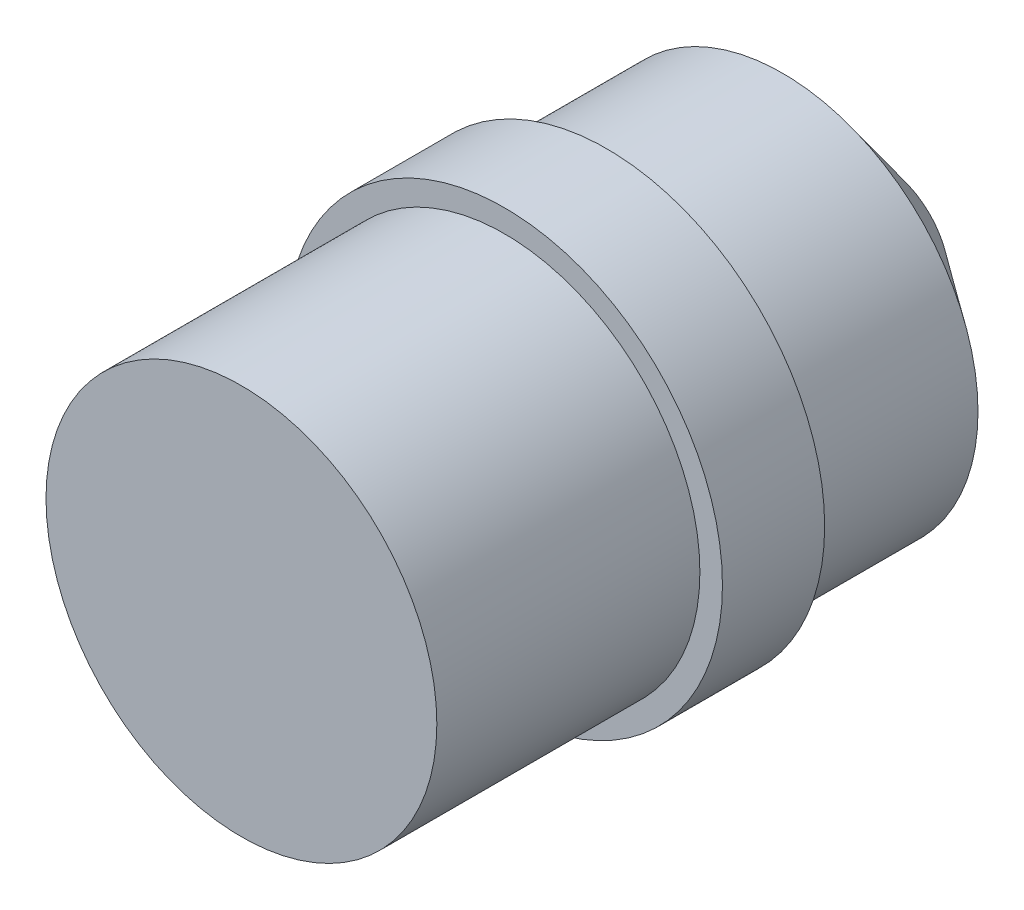
ISO-10303-21;
HEADER;
FILE_DESCRIPTION(('STEP AP214'),'2;1');
FILE_NAME('part.step','',(''),(''),'','','');
FILE_SCHEMA(('AUTOMOTIVE_DESIGN { 1 0 10303 214 1 1 1 1 }'));
ENDSEC;
DATA;
#1=APPLICATION_CONTEXT('core data for automotive mechanical design processes');
#2=APPLICATION_PROTOCOL_DEFINITION('international standard','automotive_design',2000,#1);
#3=PRODUCT_CONTEXT('',#1,'mechanical');
#4=PRODUCT('Part','Part','',(#3));
#5=PRODUCT_RELATED_PRODUCT_CATEGORY('part','',(#4));
#6=PRODUCT_DEFINITION_FORMATION('','',#4);
#7=PRODUCT_DEFINITION_CONTEXT('part definition',#1,'design');
#8=PRODUCT_DEFINITION('design','',#6,#7);
#9=PRODUCT_DEFINITION_SHAPE('','',#8);
#10=(LENGTH_UNIT() NAMED_UNIT(*) SI_UNIT(.MILLI.,.METRE.));
#11=(NAMED_UNIT(*) PLANE_ANGLE_UNIT() SI_UNIT($,.RADIAN.));
#12=(NAMED_UNIT(*) SI_UNIT($,.STERADIAN.) SOLID_ANGLE_UNIT());
#13=UNCERTAINTY_MEASURE_WITH_UNIT(LENGTH_MEASURE(1.E-05),#10,'distance_accuracy_value','');
#14=(GEOMETRIC_REPRESENTATION_CONTEXT(3) GLOBAL_UNCERTAINTY_ASSIGNED_CONTEXT((#13)) GLOBAL_UNIT_ASSIGNED_CONTEXT((#10,
#11,#12)) REPRESENTATION_CONTEXT('',''));
#15=CARTESIAN_POINT('',(0.,0.,0.));
#16=DIRECTION('',(0.,0.,1.));
#17=DIRECTION('',(1.,0.,0.));
#18=AXIS2_PLACEMENT_3D('',#15,#16,#17);
#19=CARTESIAN_POINT('',(0.,0.,6.6));
#20=DIRECTION('',(0.,0.,1.));
#21=DIRECTION('',(1.,0.,0.));
#22=AXIS2_PLACEMENT_3D('',#19,#20,#21);
#23=CONICAL_SURFACE('',#22,13.,0.910568153688785);
#24=CARTESIAN_POINT('',(0.,0.,0.));
#25=DIRECTION('',(0.,0.,-1.));
#26=DIRECTION('',(-1.,0.,0.));
#27=AXIS2_PLACEMENT_3D('',#24,#25,#26);
#28=CIRCLE('',#27,4.5);
#29=CARTESIAN_POINT('',(-4.5,0.,0.));
#30=VERTEX_POINT('',#29);
#31=EDGE_CURVE('E39',#30,#30,#28,.T.);
#32=ORIENTED_EDGE('',*,*,#31,.F.);
#33=EDGE_LOOP('',(#32));
#34=FACE_BOUND('',#33,.T.);
#35=CARTESIAN_POINT('',(0.,0.,6.6));
#36=DIRECTION('',(0.,0.,-1.));
#37=DIRECTION('',(-1.,0.,0.));
#38=AXIS2_PLACEMENT_3D('',#35,#36,#37);
#39=CIRCLE('',#38,13.);
#40=CARTESIAN_POINT('',(-13.,0.,6.6));
#41=VERTEX_POINT('',#40);
#42=EDGE_CURVE('E57',#41,#41,#39,.T.);
#43=ORIENTED_EDGE('',*,*,#42,.T.);
#44=EDGE_LOOP('',(#43));
#45=FACE_BOUND('',#44,.T.);
#46=ADVANCED_FACE('F35',(#34,#45),#23,.T.);
#47=CARTESIAN_POINT('',(0.,0.,0.));
#48=DIRECTION('',(0.,0.,-1.));
#49=DIRECTION('',(-1.,0.,0.));
#50=AXIS2_PLACEMENT_3D('',#47,#48,#49);
#51=CYLINDRICAL_SURFACE('',#50,13.);
#52=ORIENTED_EDGE('',*,*,#42,.F.);
#53=EDGE_LOOP('',(#52));
#54=FACE_BOUND('',#53,.T.);
#55=CARTESIAN_POINT('',(0.,0.,18.3));
#56=DIRECTION('',(0.,0.,-1.));
#57=DIRECTION('',(-1.,0.,0.));
#58=AXIS2_PLACEMENT_3D('',#55,#56,#57);
#59=CIRCLE('',#58,13.);
#60=CARTESIAN_POINT('',(-13.,0.,18.3));
#61=VERTEX_POINT('',#60);
#62=EDGE_CURVE('E55',#61,#61,#59,.T.);
#63=ORIENTED_EDGE('',*,*,#62,.T.);
#64=EDGE_LOOP('',(#63));
#65=FACE_BOUND('',#64,.T.);
#66=ADVANCED_FACE('F80',(#54,#65),#51,.T.);
#67=CARTESIAN_POINT('',(-13.,0.,18.3));
#68=DIRECTION('',(0.,0.,1.));
#69=DIRECTION('',(1.,0.,0.));
#70=AXIS2_PLACEMENT_3D('',#67,#68,#69);
#71=PLANE('',#70);
#72=ORIENTED_EDGE('',*,*,#62,.F.);
#73=EDGE_LOOP('',(#72));
#74=FACE_BOUND('',#73,.T.);
#75=CARTESIAN_POINT('',(0.,0.,18.3));
#76=DIRECTION('',(0.,0.,-1.));
#77=DIRECTION('',(-1.,0.,0.));
#78=AXIS2_PLACEMENT_3D('',#75,#76,#77);
#79=CIRCLE('',#78,14.5);
#80=CARTESIAN_POINT('',(-14.5,0.,18.3));
#81=VERTEX_POINT('',#80);
#82=EDGE_CURVE('E52',#81,#81,#79,.T.);
#83=ORIENTED_EDGE('',*,*,#82,.T.);
#84=EDGE_LOOP('',(#83));
#85=FACE_BOUND('',#84,.T.);
#86=ADVANCED_FACE('F85',(#74,#85),#71,.F.);
#87=CARTESIAN_POINT('',(0.,0.,0.));
#88=DIRECTION('',(0.,0.,1.));
#89=DIRECTION('',(1.,0.,0.));
#90=AXIS2_PLACEMENT_3D('',#87,#88,#89);
#91=PLANE('',#90);
#92=ORIENTED_EDGE('',*,*,#31,.T.);
#93=EDGE_LOOP('',(#92));
#94=FACE_BOUND('',#93,.T.);
#95=ADVANCED_FACE('F91',(#94),#91,.F.);
#96=CARTESIAN_POINT('',(0.,0.,42.6));
#97=DIRECTION('',(0.,0.,-1.));
#98=DIRECTION('',(-1.,0.,0.));
#99=AXIS2_PLACEMENT_3D('',#96,#97,#98);
#100=CYLINDRICAL_SURFACE('',#99,14.5);
#101=CARTESIAN_POINT('',(0.,0.,25.1));
#102=DIRECTION('',(0.,0.,-1.));
#103=DIRECTION('',(-1.,0.,0.));
#104=AXIS2_PLACEMENT_3D('',#101,#102,#103);
#105=CIRCLE('',#104,14.5);
#106=CARTESIAN_POINT('',(-14.5,0.,25.1));
#107=VERTEX_POINT('',#106);
#108=EDGE_CURVE('E10',#107,#107,#105,.T.);
#109=ORIENTED_EDGE('',*,*,#108,.T.);
#110=EDGE_LOOP('',(#109));
#111=FACE_BOUND('',#110,.T.);
#112=ORIENTED_EDGE('',*,*,#82,.F.);
#113=EDGE_LOOP('',(#112));
#114=FACE_BOUND('',#113,.T.);
#115=ADVANCED_FACE('F37',(#111,#114),#100,.T.);
#116=CARTESIAN_POINT('',(-14.5,0.,25.1));
#117=DIRECTION('',(0.,0.,-1.));
#118=DIRECTION('',(-1.,0.,0.));
#119=AXIS2_PLACEMENT_3D('',#116,#117,#118);
#120=PLANE('',#119);
#121=ORIENTED_EDGE('',*,*,#108,.F.);
#122=EDGE_LOOP('',(#121));
#123=FACE_BOUND('',#122,.T.);
#124=CARTESIAN_POINT('',(0.,0.,25.1));
#125=DIRECTION('',(0.,0.,-1.));
#126=DIRECTION('',(-1.,0.,0.));
#127=AXIS2_PLACEMENT_3D('',#124,#125,#126);
#128=CIRCLE('',#127,13.);
#129=CARTESIAN_POINT('',(-13.,0.,25.1));
#130=VERTEX_POINT('',#129);
#131=EDGE_CURVE('E43',#130,#130,#128,.T.);
#132=ORIENTED_EDGE('',*,*,#131,.T.);
#133=EDGE_LOOP('',(#132));
#134=FACE_BOUND('',#133,.T.);
#135=ADVANCED_FACE('F75',(#123,#134),#120,.F.);
#136=CARTESIAN_POINT('',(0.,0.,0.));
#137=DIRECTION('',(0.,0.,-1.));
#138=DIRECTION('',(-1.,0.,0.));
#139=AXIS2_PLACEMENT_3D('',#136,#137,#138);
#140=CYLINDRICAL_SURFACE('',#139,13.);
#141=ORIENTED_EDGE('',*,*,#131,.F.);
#142=EDGE_LOOP('',(#141));
#143=FACE_BOUND('',#142,.T.);
#144=CARTESIAN_POINT('',(0.,0.,42.6));
#145=DIRECTION('',(0.,0.,-1.));
#146=DIRECTION('',(-1.,0.,0.));
#147=AXIS2_PLACEMENT_3D('',#144,#145,#146);
#148=CIRCLE('',#147,13.);
#149=CARTESIAN_POINT('',(-13.,0.,42.6));
#150=VERTEX_POINT('',#149);
#151=EDGE_CURVE('E48',#150,#150,#148,.T.);
#152=ORIENTED_EDGE('',*,*,#151,.T.);
#153=EDGE_LOOP('',(#152));
#154=FACE_BOUND('',#153,.T.);
#155=ADVANCED_FACE('F67',(#143,#154),#140,.T.);
#156=CARTESIAN_POINT('',(0.,0.,42.6));
#157=DIRECTION('',(0.,0.,1.));
#158=DIRECTION('',(1.,0.,0.));
#159=AXIS2_PLACEMENT_3D('',#156,#157,#158);
#160=PLANE('',#159);
#161=ORIENTED_EDGE('',*,*,#151,.F.);
#162=EDGE_LOOP('',(#161));
#163=FACE_BOUND('',#162,.T.);
#164=ADVANCED_FACE('F69',(#163),#160,.T.);
#165=CLOSED_SHELL('',(#46,#66,#86,#95,#115,#135,#155,#164));
#166=MANIFOLD_SOLID_BREP('B2',#165);
#167=ADVANCED_BREP_SHAPE_REPRESENTATION('',(#18,#166),#14);
#168=SHAPE_DEFINITION_REPRESENTATION(#9,#167);
ENDSEC;
END-ISO-10303-21;
